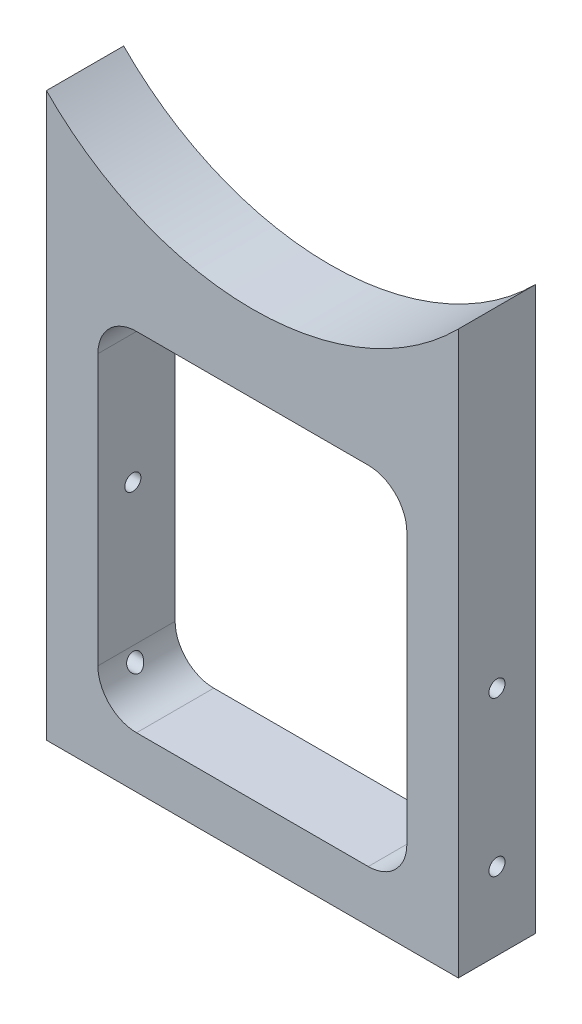
ISO-10303-21;
HEADER;
FILE_DESCRIPTION(('STEP AP214'),'2;1');
FILE_NAME('part.step','',(''),(''),'','','');
FILE_SCHEMA(('AUTOMOTIVE_DESIGN { 1 0 10303 214 1 1 1 1 }'));
ENDSEC;
DATA;
#1=APPLICATION_CONTEXT('core data for automotive mechanical design processes');
#2=APPLICATION_PROTOCOL_DEFINITION('international standard','automotive_design',2000,#1);
#3=PRODUCT_CONTEXT('',#1,'mechanical');
#4=PRODUCT('Part','Part','',(#3));
#5=PRODUCT_RELATED_PRODUCT_CATEGORY('part','',(#4));
#6=PRODUCT_DEFINITION_FORMATION('','',#4);
#7=PRODUCT_DEFINITION_CONTEXT('part definition',#1,'design');
#8=PRODUCT_DEFINITION('design','',#6,#7);
#9=PRODUCT_DEFINITION_SHAPE('','',#8);
#10=(LENGTH_UNIT() NAMED_UNIT(*) SI_UNIT(.MILLI.,.METRE.));
#11=(NAMED_UNIT(*) PLANE_ANGLE_UNIT() SI_UNIT($,.RADIAN.));
#12=(NAMED_UNIT(*) SI_UNIT($,.STERADIAN.) SOLID_ANGLE_UNIT());
#13=UNCERTAINTY_MEASURE_WITH_UNIT(LENGTH_MEASURE(1.E-05),#10,'distance_accuracy_value','');
#14=(GEOMETRIC_REPRESENTATION_CONTEXT(3) GLOBAL_UNCERTAINTY_ASSIGNED_CONTEXT((#13)) GLOBAL_UNIT_ASSIGNED_CONTEXT((#10,
#11,#12)) REPRESENTATION_CONTEXT('',''));
#15=CARTESIAN_POINT('',(0.,0.,0.));
#16=DIRECTION('',(0.,0.,1.));
#17=DIRECTION('',(1.,0.,0.));
#18=AXIS2_PLACEMENT_3D('',#15,#16,#17);
#19=CARTESIAN_POINT('',(-9.00000000000001,9.5,6.));
#20=DIRECTION('',(0.,0.,-1.));
#21=DIRECTION('',(-1.,0.,0.));
#22=AXIS2_PLACEMENT_3D('',#19,#20,#21);
#23=CYLINDRICAL_SURFACE('',#22,3.);
#24=CARTESIAN_POINT('',(-9.00000000000001,9.5,0.));
#25=DIRECTION('',(0.,0.,1.));
#26=DIRECTION('',(1.,0.,0.));
#27=AXIS2_PLACEMENT_3D('',#24,#25,#26);
#28=CIRCLE('',#27,3.);
#29=CARTESIAN_POINT('',(-8.99999999999998,12.5,0.));
#30=VERTEX_POINT('',#29);
#31=CARTESIAN_POINT('',(-12.,9.49999999999998,0.));
#32=VERTEX_POINT('',#31);
#33=EDGE_CURVE('E178',#30,#32,#28,.T.);
#34=ORIENTED_EDGE('',*,*,#33,.F.);
#35=DIRECTION('',(0.,0.,-1.));
#36=VECTOR('',#35,1.);
#37=CARTESIAN_POINT('',(-8.99999999999998,12.5,6.));
#38=LINE('',#37,#36);
#39=CARTESIAN_POINT('',(-8.99999999999998,12.5,6.));
#40=VERTEX_POINT('',#39);
#41=EDGE_CURVE('E11',#40,#30,#38,.T.);
#42=ORIENTED_EDGE('',*,*,#41,.F.);
#43=CARTESIAN_POINT('',(-9.00000000000001,9.5,6.));
#44=DIRECTION('',(0.,0.,1.));
#45=DIRECTION('',(1.,0.,0.));
#46=AXIS2_PLACEMENT_3D('',#43,#44,#45);
#47=CIRCLE('',#46,3.);
#48=CARTESIAN_POINT('',(-12.,9.49999999999998,6.));
#49=VERTEX_POINT('',#48);
#50=EDGE_CURVE('E235',#40,#49,#47,.T.);
#51=ORIENTED_EDGE('',*,*,#50,.T.);
#52=DIRECTION('',(0.,0.,-1.));
#53=VECTOR('',#52,1.);
#54=CARTESIAN_POINT('',(-12.,9.49999999999998,6.));
#55=LINE('',#54,#53);
#56=EDGE_CURVE('E104',#49,#32,#55,.T.);
#57=ORIENTED_EDGE('',*,*,#56,.T.);
#58=EDGE_LOOP('',(#34,#42,#51,#57));
#59=FACE_BOUND('',#58,.T.);
#60=ADVANCED_FACE('F39',(#59),#23,.F.);
#61=CARTESIAN_POINT('',(0.,12.5,6.));
#62=DIRECTION('',(0.,1.,0.));
#63=DIRECTION('',(0.,0.,1.));
#64=AXIS2_PLACEMENT_3D('',#61,#62,#63);
#65=PLANE('',#64);
#66=DIRECTION('',(1.,0.,0.));
#67=VECTOR('',#66,1.);
#68=CARTESIAN_POINT('',(0.,12.5,0.));
#69=LINE('',#68,#67);
#70=CARTESIAN_POINT('',(8.99999999999998,12.5,0.));
#71=VERTEX_POINT('',#70);
#72=EDGE_CURVE('E181',#30,#71,#69,.T.);
#73=ORIENTED_EDGE('',*,*,#72,.T.);
#74=DIRECTION('',(0.,0.,-1.));
#75=VECTOR('',#74,1.);
#76=CARTESIAN_POINT('',(8.99999999999998,12.5,6.));
#77=LINE('',#76,#75);
#78=CARTESIAN_POINT('',(8.99999999999998,12.5,6.));
#79=VERTEX_POINT('',#78);
#80=EDGE_CURVE('E49',#79,#71,#77,.T.);
#81=ORIENTED_EDGE('',*,*,#80,.F.);
#82=DIRECTION('',(1.,0.,0.));
#83=VECTOR('',#82,1.);
#84=CARTESIAN_POINT('',(0.,12.5,6.));
#85=LINE('',#84,#83);
#86=EDGE_CURVE('E241',#40,#79,#85,.T.);
#87=ORIENTED_EDGE('',*,*,#86,.F.);
#88=ORIENTED_EDGE('',*,*,#41,.T.);
#89=EDGE_LOOP('',(#73,#81,#87,#88));
#90=FACE_BOUND('',#89,.T.);
#91=ADVANCED_FACE('F273',(#90),#65,.F.);
#92=CARTESIAN_POINT('',(9.,9.5,6.));
#93=DIRECTION('',(0.,0.,-1.));
#94=DIRECTION('',(-1.,0.,0.));
#95=AXIS2_PLACEMENT_3D('',#92,#93,#94);
#96=CYLINDRICAL_SURFACE('',#95,3.);
#97=CARTESIAN_POINT('',(9.,9.5,0.));
#98=DIRECTION('',(0.,0.,1.));
#99=DIRECTION('',(1.,0.,0.));
#100=AXIS2_PLACEMENT_3D('',#97,#98,#99);
#101=CIRCLE('',#100,3.);
#102=CARTESIAN_POINT('',(12.,9.49999999999998,0.));
#103=VERTEX_POINT('',#102);
#104=EDGE_CURVE('E184',#71,#103,#101,.F.);
#105=ORIENTED_EDGE('',*,*,#104,.T.);
#106=DIRECTION('',(0.,0.,-1.));
#107=VECTOR('',#106,1.);
#108=CARTESIAN_POINT('',(12.,9.49999999999998,6.));
#109=LINE('',#108,#107);
#110=CARTESIAN_POINT('',(12.,9.49999999999998,6.));
#111=VERTEX_POINT('',#110);
#112=EDGE_CURVE('E204',#111,#103,#109,.T.);
#113=ORIENTED_EDGE('',*,*,#112,.F.);
#114=CARTESIAN_POINT('',(9.,9.5,6.));
#115=DIRECTION('',(0.,0.,1.));
#116=DIRECTION('',(1.,0.,0.));
#117=AXIS2_PLACEMENT_3D('',#114,#115,#116);
#118=CIRCLE('',#117,3.);
#119=EDGE_CURVE('E244',#79,#111,#118,.F.);
#120=ORIENTED_EDGE('',*,*,#119,.F.);
#121=ORIENTED_EDGE('',*,*,#80,.T.);
#122=EDGE_LOOP('',(#105,#113,#120,#121));
#123=FACE_BOUND('',#122,.T.);
#124=ADVANCED_FACE('F255',(#123),#96,.F.);
#125=CARTESIAN_POINT('',(12.,0.,6.));
#126=DIRECTION('',(-1.,0.,0.));
#127=DIRECTION('',(0.,-1.,0.));
#128=AXIS2_PLACEMENT_3D('',#125,#126,#127);
#129=PLANE('',#128);
#130=CARTESIAN_POINT('',(12.,-0.5,3.));
#131=DIRECTION('',(-1.,0.,0.));
#132=DIRECTION('',(0.,-1.,0.));
#133=AXIS2_PLACEMENT_3D('',#130,#131,#132);
#134=CIRCLE('',#133,0.625);
#135=CARTESIAN_POINT('',(12.,-1.125,3.));
#136=VERTEX_POINT('',#135);
#137=EDGE_CURVE('E169',#136,#136,#134,.T.);
#138=ORIENTED_EDGE('',*,*,#137,.F.);
#139=EDGE_LOOP('',(#138));
#140=FACE_BOUND('',#139,.T.);
#141=DIRECTION('',(0.,1.,0.));
#142=VECTOR('',#141,1.);
#143=CARTESIAN_POINT('',(12.,0.,0.));
#144=LINE('',#143,#142);
#145=CARTESIAN_POINT('',(12.,-11.5,0.));
#146=VERTEX_POINT('',#145);
#147=EDGE_CURVE('E187',#146,#103,#144,.T.);
#148=ORIENTED_EDGE('',*,*,#147,.F.);
#149=DIRECTION('',(0.,0.,-1.));
#150=VECTOR('',#149,1.);
#151=CARTESIAN_POINT('',(12.,-11.5,6.));
#152=LINE('',#151,#150);
#153=CARTESIAN_POINT('',(12.,-11.5,6.));
#154=VERTEX_POINT('',#153);
#155=EDGE_CURVE('E202',#154,#146,#152,.T.);
#156=ORIENTED_EDGE('',*,*,#155,.F.);
#157=DIRECTION('',(0.,1.,0.));
#158=VECTOR('',#157,1.);
#159=CARTESIAN_POINT('',(12.,0.,6.));
#160=LINE('',#159,#158);
#161=EDGE_CURVE('E246',#154,#111,#160,.T.);
#162=ORIENTED_EDGE('',*,*,#161,.T.);
#163=ORIENTED_EDGE('',*,*,#112,.T.);
#164=EDGE_LOOP('',(#148,#156,#162,#163));
#165=FACE_BOUND('',#164,.T.);
#166=ADVANCED_FACE('F250',(#140,#165),#129,.T.);
#167=CARTESIAN_POINT('',(9.,-11.5,6.));
#168=DIRECTION('',(0.,0.,-1.));
#169=DIRECTION('',(-1.,0.,0.));
#170=AXIS2_PLACEMENT_3D('',#167,#168,#169);
#171=CYLINDRICAL_SURFACE('',#170,3.);
#172=CARTESIAN_POINT('',(11.9764702249477,-11.875,3.));
#173=CARTESIAN_POINT('',(11.9764703090511,-11.8750003356118,3.03482382226987));
#174=CARTESIAN_POINT('',(11.9761069646786,-11.877918143304,3.06965128197802));
#175=CARTESIAN_POINT('',(11.974612501748,-11.8895047090639,3.13832365698512));
#176=CARTESIAN_POINT('',(11.9734812511529,-11.8981744561397,3.17216840226802));
#177=CARTESIAN_POINT('',(11.9703343283495,-11.9210058395248,3.23791064601869));
#178=CARTESIAN_POINT('',(11.9683186254897,-11.9351676661668,3.26980807695628));
#179=CARTESIAN_POINT('',(11.9632324186143,-11.9685481148077,3.33074242977188));
#180=CARTESIAN_POINT('',(11.9601619897179,-11.9877663766569,3.35977955517572));
#181=CARTESIAN_POINT('',(11.9527813176848,-12.0306154037981,3.41412332984023));
#182=CARTESIAN_POINT('',(11.948473380135,-12.0542379350877,3.43943678522055));
#183=CARTESIAN_POINT('',(11.9384439825653,-12.1051601702134,3.48570561173041));
#184=CARTESIAN_POINT('',(11.9327225852513,-12.1324597109002,3.50666117611536));
#185=CARTESIAN_POINT('',(11.9197416476608,-12.1899102828414,3.54372807498777));
#186=CARTESIAN_POINT('',(11.9124792894811,-12.2200664812704,3.55983040214307));
#187=CARTESIAN_POINT('',(11.8964004962904,-12.2822369617458,3.58681607228027));
#188=CARTESIAN_POINT('',(11.8875839400068,-12.3142513886571,3.5976990077515));
#189=CARTESIAN_POINT('',(11.8682526175938,-12.3799581982609,3.61432114663219));
#190=CARTESIAN_POINT('',(11.8577026616999,-12.4136723528713,3.61993279738662));
#191=CARTESIAN_POINT('',(11.8352563454918,-12.4811146386056,3.62563142152863));
#192=CARTESIAN_POINT('',(11.8233596461453,-12.5148427711096,3.6257170006583));
#193=CARTESIAN_POINT('',(11.7977975602801,-12.5833935624684,3.62041833341663));
#194=CARTESIAN_POINT('',(11.784069956605,-12.6181686621229,3.61472130395371));
#195=CARTESIAN_POINT('',(11.7558603723934,-12.6859953839881,3.59770775952619));
#196=CARTESIAN_POINT('',(11.7413781239435,-12.7190463856626,3.58638923648893));
#197=CARTESIAN_POINT('',(11.7111471244074,-12.7849452757464,3.55750684987418));
#198=CARTESIAN_POINT('',(11.695380370586,-12.8176189774986,3.53956319218695));
#199=CARTESIAN_POINT('',(11.6642745805296,-12.8794347499195,3.49803793650123));
#200=CARTESIAN_POINT('',(11.6489358370762,-12.9085744466333,3.47445257997987));
#201=CARTESIAN_POINT('',(11.6192676675109,-12.9630160837033,3.4215554918017));
#202=CARTESIAN_POINT('',(11.6049628268777,-12.9882349875253,3.39214386463641));
#203=CARTESIAN_POINT('',(11.5787774163117,-13.0331615582233,3.32844555559407));
#204=CARTESIAN_POINT('',(11.5668929668782,-13.0528780636551,3.29416682701525));
#205=CARTESIAN_POINT('',(11.5491365522744,-13.0818088951998,3.23030937556022));
#206=CARTESIAN_POINT('',(11.5425064628171,-13.0924069902816,3.2015651115043));
#207=CARTESIAN_POINT('',(11.5318233805545,-13.109338883508,3.14239252898424));
#208=CARTESIAN_POINT('',(11.527768206008,-13.1156762920268,3.11196566003208));
#209=CARTESIAN_POINT('',(11.5225795388462,-13.1237662006149,3.05015255755757));
#210=CARTESIAN_POINT('',(11.5214557646674,-13.1255034501189,3.01876348106536));
#211=CARTESIAN_POINT('',(11.5222671131103,-13.1242441604155,2.95611859809129));
#212=CARTESIAN_POINT('',(11.5242023828447,-13.1212473935443,2.92486279809132));
#213=CARTESIAN_POINT('',(11.5307668141299,-13.1109788819801,2.86508726225721));
#214=CARTESIAN_POINT('',(11.5352485713544,-13.1039408488149,2.83651015410968));
#215=CARTESIAN_POINT('',(11.5464423504161,-13.0861088962035,2.78102206334978));
#216=CARTESIAN_POINT('',(11.5531548686801,-13.0753141407223,2.75411145317761));
#217=CARTESIAN_POINT('',(11.5689120267604,-13.0494949154549,2.70062832881701));
#218=CARTESIAN_POINT('',(11.5780876415788,-13.0342260532607,2.67421317433335));
#219=CARTESIAN_POINT('',(11.5979477498059,-13.0003509563189,2.62425249837677));
#220=CARTESIAN_POINT('',(11.6086329774338,-12.9817430964111,2.60070838371353));
#221=CARTESIAN_POINT('',(11.6326156042512,-12.9387575110524,2.55359849460178));
#222=CARTESIAN_POINT('',(11.6460676416854,-12.9139348259913,2.53051701936545));
#223=CARTESIAN_POINT('',(11.6736173024196,-12.8611241097611,2.48877729209727));
#224=CARTESIAN_POINT('',(11.6877153030313,-12.8331342142063,2.47012166556775));
#225=CARTESIAN_POINT('',(11.7175742047442,-12.7712578694488,2.43570092792535));
#226=CARTESIAN_POINT('',(11.7333440430715,-12.7370622292115,2.42049575219016));
#227=CARTESIAN_POINT('',(11.7642946215852,-12.6662623666049,2.39636043974739));
#228=CARTESIAN_POINT('',(11.7794752610239,-12.6296577351794,2.38743137176991));
#229=CARTESIAN_POINT('',(11.8088417182555,-12.5545385736942,2.37621435390957));
#230=CARTESIAN_POINT('',(11.8230139196794,-12.5160067877993,2.37400481393952));
#231=CARTESIAN_POINT('',(11.8496769926953,-12.4386230530258,2.37681883712478));
#232=CARTESIAN_POINT('',(11.862168610686,-12.3997712544652,2.38183917759542));
#233=CARTESIAN_POINT('',(11.8844033135709,-12.3256033144596,2.39869896992142));
#234=CARTESIAN_POINT('',(11.8942714729548,-12.2902204502091,2.41007925988178));
#235=CARTESIAN_POINT('',(11.9121257848968,-12.2216495460354,2.43916920269116));
#236=CARTESIAN_POINT('',(11.9201126964338,-12.1884606248791,2.45687629574467));
#237=CARTESIAN_POINT('',(11.9337813968351,-12.1275666612881,2.49685076752733));
#238=CARTESIAN_POINT('',(11.9395784290266,-12.0996461812289,2.51875146527051));
#239=CARTESIAN_POINT('',(11.9496840713564,-12.0477801575039,2.56712701529801));
#240=CARTESIAN_POINT('',(11.9539928663597,-12.0238341203346,2.59360129884943));
#241=CARTESIAN_POINT('',(11.9612148674723,-11.9813114980026,2.64958588334438));
#242=CARTESIAN_POINT('',(11.9641624764304,-11.9626078744344,2.67899543732252));
#243=CARTESIAN_POINT('',(11.9690217915971,-11.9303223824811,2.74057663078007));
#244=CARTESIAN_POINT('',(11.9709337003357,-11.9167395128961,2.77274772881603));
#245=CARTESIAN_POINT('',(11.9738060610007,-11.8957071029608,2.8370976758456));
#246=CARTESIAN_POINT('',(11.9748133144291,-11.8879597223175,2.86917755630227));
#247=CARTESIAN_POINT('',(11.9761453604752,-11.8776059834388,2.93417053499787));
#248=CARTESIAN_POINT('',(11.976470145451,-11.8749996827713,2.96708364256278));
#249=CARTESIAN_POINT('',(11.9764702249477,-11.875,3.));
#250=B_SPLINE_CURVE_WITH_KNOTS('',3,(#172,#173,#174,#175,#176,#177,#178,#179,#180,#181,#182,
#183,#184,#185,#186,#187,#188,#189,#190,#191,#192,#193,#194,#195,#196,#197,#198,#199,#200,#201,
#202,#203,#204,#205,#206,#207,#208,#209,#210,#211,#212,#213,#214,#215,#216,#217,#218,#219,#220,
#221,#222,#223,#224,#225,#226,#227,#228,#229,#230,#231,#232,#233,#234,#235,#236,#237,#238,#239,
#240,#241,#242,#243,#244,#245,#246,#247,#248,#249),.UNSPECIFIED.,.T.,.F.,(4,2,2,2,2,2,2,2,2,2,2,
2,2,2,2,2,2,2,2,2,2,2,2,2,2,2,2,2,2,2,2,2,2,2,2,2,2,2,4),(0.,0.104354650583023,
0.208727248914331,0.31310346468957,0.417472248173352,0.521647830769545,0.625818792600818,
0.730181915878858,0.834553186115117,0.941389448713036,1.04825266657554,1.16122122666544,
1.27423016969034,1.39510325608939,1.51605709401289,1.63929925984822,1.76234230595295,
1.85598096068991,1.94954016857685,2.0434091602648,2.13728266634628,2.22620704896979,
2.31515123382263,2.41036106341917,2.50561735995585,2.61457938923046,2.72360589623751,
2.84487698813629,2.96616872574293,3.08887048396358,3.21151756538756,3.32627948303905,
3.44099502102518,3.54833024284059,3.65565212694041,3.76008895241692,3.86450534800526,
3.96314289816437,4.06178155282461),.UNSPECIFIED.);
#251=CARTESIAN_POINT('',(11.9764702249477,-11.875,3.));
#252=VERTEX_POINT('',#251);
#253=EDGE_CURVE('E339',#252,#252,#250,.T.);
#254=ORIENTED_EDGE('',*,*,#253,.T.);
#255=EDGE_LOOP('',(#254));
#256=FACE_BOUND('',#255,.T.);
#257=CARTESIAN_POINT('',(9.,-11.5,0.));
#258=DIRECTION('',(0.,0.,1.));
#259=DIRECTION('',(1.,0.,0.));
#260=AXIS2_PLACEMENT_3D('',#257,#258,#259);
#261=CIRCLE('',#260,3.);
#262=CARTESIAN_POINT('',(8.99999999999998,-14.5,0.));
#263=VERTEX_POINT('',#262);
#264=EDGE_CURVE('E190',#146,#263,#261,.F.);
#265=ORIENTED_EDGE('',*,*,#264,.T.);
#266=DIRECTION('',(0.,0.,-1.));
#267=VECTOR('',#266,1.);
#268=CARTESIAN_POINT('',(8.99999999999998,-14.5,6.));
#269=LINE('',#268,#267);
#270=CARTESIAN_POINT('',(8.99999999999998,-14.5,6.));
#271=VERTEX_POINT('',#270);
#272=EDGE_CURVE('E150',#271,#263,#269,.T.);
#273=ORIENTED_EDGE('',*,*,#272,.F.);
#274=CARTESIAN_POINT('',(9.,-11.5,6.));
#275=DIRECTION('',(0.,0.,1.));
#276=DIRECTION('',(1.,0.,0.));
#277=AXIS2_PLACEMENT_3D('',#274,#275,#276);
#278=CIRCLE('',#277,3.);
#279=EDGE_CURVE('E156',#154,#271,#278,.F.);
#280=ORIENTED_EDGE('',*,*,#279,.F.);
#281=ORIENTED_EDGE('',*,*,#155,.T.);
#282=EDGE_LOOP('',(#265,#273,#280,#281));
#283=FACE_BOUND('',#282,.T.);
#284=ADVANCED_FACE('F259',(#256,#283),#171,.F.);
#285=CARTESIAN_POINT('',(0.,-14.5,6.));
#286=DIRECTION('',(0.,1.,0.));
#287=DIRECTION('',(0.,0.,1.));
#288=AXIS2_PLACEMENT_3D('',#285,#286,#287);
#289=PLANE('',#288);
#290=DIRECTION('',(1.,0.,0.));
#291=VECTOR('',#290,1.);
#292=CARTESIAN_POINT('',(0.,-14.5,0.));
#293=LINE('',#292,#291);
#294=CARTESIAN_POINT('',(-8.99999999999998,-14.5,0.));
#295=VERTEX_POINT('',#294);
#296=EDGE_CURVE('E145',#295,#263,#293,.T.);
#297=ORIENTED_EDGE('',*,*,#296,.F.);
#298=DIRECTION('',(0.,0.,-1.));
#299=VECTOR('',#298,1.);
#300=CARTESIAN_POINT('',(-8.99999999999998,-14.5,6.));
#301=LINE('',#300,#299);
#302=CARTESIAN_POINT('',(-8.99999999999998,-14.5,6.));
#303=VERTEX_POINT('',#302);
#304=EDGE_CURVE('E140',#303,#295,#301,.T.);
#305=ORIENTED_EDGE('',*,*,#304,.F.);
#306=DIRECTION('',(1.,0.,0.));
#307=VECTOR('',#306,1.);
#308=CARTESIAN_POINT('',(0.,-14.5,6.));
#309=LINE('',#308,#307);
#310=EDGE_CURVE('E143',#303,#271,#309,.T.);
#311=ORIENTED_EDGE('',*,*,#310,.T.);
#312=ORIENTED_EDGE('',*,*,#272,.T.);
#313=EDGE_LOOP('',(#297,#305,#311,#312));
#314=FACE_BOUND('',#313,.T.);
#315=ADVANCED_FACE('F142',(#314),#289,.T.);
#316=CARTESIAN_POINT('',(-9.,-11.5,6.));
#317=DIRECTION('',(0.,0.,-1.));
#318=DIRECTION('',(-1.,0.,0.));
#319=AXIS2_PLACEMENT_3D('',#316,#317,#318);
#320=CYLINDRICAL_SURFACE('',#319,3.);
#321=CARTESIAN_POINT('',(-11.8284271247462,-12.5,3.90977548780326));
#322=CARTESIAN_POINT('',(-11.8150124089229,-12.5379398472598,3.90977444655704));
#323=CARTESIAN_POINT('',(-11.8008233549699,-12.5756205844147,3.90631255338893));
#324=CARTESIAN_POINT('',(-11.7713770583407,-12.6493698791965,3.89282343235476));
#325=CARTESIAN_POINT('',(-11.7561187851211,-12.6854368250002,3.88278979051909));
#326=CARTESIAN_POINT('',(-11.725161602672,-12.7549658706356,3.85660966766704));
#327=CARTESIAN_POINT('',(-11.7094637298049,-12.788433493368,3.84047659992287));
#328=CARTESIAN_POINT('',(-11.6782713670648,-12.8520798144015,3.80250006151009));
#329=CARTESIAN_POINT('',(-11.6627769423295,-12.8822574809085,3.7806548066471));
#330=CARTESIAN_POINT('',(-11.6323971108842,-12.9392904029245,3.73100023505401));
#331=CARTESIAN_POINT('',(-11.6175386637874,-12.9660366299111,3.70304841436614));
#332=CARTESIAN_POINT('',(-11.5899252344519,-13.0142854578126,3.64204663804565));
#333=CARTESIAN_POINT('',(-11.5771675246426,-13.0357948757897,3.60900340275176));
#334=CARTESIAN_POINT('',(-11.5574495786823,-13.0683523186817,3.54658463469864));
#335=CARTESIAN_POINT('',(-11.5498307115423,-13.0806664735583,3.51807523660657));
#336=CARTESIAN_POINT('',(-11.5370990533401,-13.1010226322127,3.45904274077041));
#337=CARTESIAN_POINT('',(-11.5319841178287,-13.1090682921662,3.42852139163973));
#338=CARTESIAN_POINT('',(-11.5246856931419,-13.1204967614912,3.36612910163082));
#339=CARTESIAN_POINT('',(-11.5225147363225,-13.1238596381303,3.33425298312588));
#340=CARTESIAN_POINT('',(-11.5213613939655,-13.125650106771,3.27030367132598));
#341=CARTESIAN_POINT('',(-11.5223786156088,-13.1240783067797,3.23823050279575));
#342=CARTESIAN_POINT('',(-11.5273129384284,-13.1163870264236,3.17720793274542));
#343=CARTESIAN_POINT('',(-11.5310191522684,-13.1105981480643,3.14819836267385));
#344=CARTESIAN_POINT('',(-11.5407905128396,-13.0951383853412,3.09165667390315));
#345=CARTESIAN_POINT('',(-11.5468560968948,-13.0854667812793,3.06412483018708));
#346=CARTESIAN_POINT('',(-11.5612850724044,-13.062055124972,3.00974918167677));
#347=CARTESIAN_POINT('',(-11.5697492713129,-13.0481338463928,2.98301082442993));
#348=CARTESIAN_POINT('',(-11.5882964014913,-13.0169215914557,2.9322031468155));
#349=CARTESIAN_POINT('',(-11.5983800541937,-12.9996291125614,2.90813502409831));
#350=CARTESIAN_POINT('',(-11.6211537744895,-12.9595050984903,2.85980616539485));
#351=CARTESIAN_POINT('',(-11.6340112251048,-12.9362374453846,2.8359863445484));
#352=CARTESIAN_POINT('',(-11.6605300519434,-12.886497516833,2.79249758592286));
#353=CARTESIAN_POINT('',(-11.6741919085139,-12.8600233164324,2.77283116113981));
#354=CARTESIAN_POINT('',(-11.7034610367323,-12.8009657704798,2.73577227274815));
#355=CARTESIAN_POINT('',(-11.7191001844444,-12.7680317392269,2.71896064371658));
#356=CARTESIAN_POINT('',(-11.7499952593537,-12.6995571703877,2.69134031059232));
#357=CARTESIAN_POINT('',(-11.765251080644,-12.6640159228729,2.68053324842502));
#358=CARTESIAN_POINT('',(-11.7952088462745,-12.5901549897254,2.66513121731209));
#359=CARTESIAN_POINT('',(-11.8098831172494,-12.5517852587772,2.66071964717653));
#360=CARTESIAN_POINT('',(-11.8376700387615,-12.4743300764685,2.65910416181911));
#361=CARTESIAN_POINT('',(-11.8507832903115,-12.4352449072919,2.66189746317787));
#362=CARTESIAN_POINT('',(-11.8743660972348,-12.3599346682431,2.67454618696307));
#363=CARTESIAN_POINT('',(-11.8849442252337,-12.3236742470978,2.68398684910967));
#364=CARTESIAN_POINT('',(-11.904193227412,-12.2529955204582,2.7094299861694));
#365=CARTESIAN_POINT('',(-11.9128649356625,-12.2185764143839,2.72542958269376));
#366=CARTESIAN_POINT('',(-11.9277587640368,-12.1551483173406,2.76232386092127));
#367=CARTESIAN_POINT('',(-11.9341078493796,-12.1259303149646,2.78280895063924));
#368=CARTESIAN_POINT('',(-11.9452435371163,-12.0712443905536,2.82863370810013));
#369=CARTESIAN_POINT('',(-11.9500304332776,-12.045775763949,2.85397246169489));
#370=CARTESIAN_POINT('',(-11.9580889054168,-12.0002291773139,2.90786893683274));
#371=CARTESIAN_POINT('',(-11.9614049129787,-11.9800021783309,2.93629430691634));
#372=CARTESIAN_POINT('',(-11.966938501963,-11.9445216753647,2.99619226162851));
#373=CARTESIAN_POINT('',(-11.9691561261002,-11.9292679779843,3.02766472770267));
#374=CARTESIAN_POINT('',(-11.9726637228966,-11.9042647905324,3.09260435207056));
#375=CARTESIAN_POINT('',(-11.9739579313089,-11.8944902123476,3.12606162983394));
#376=CARTESIAN_POINT('',(-11.9757639015606,-11.8806292062351,3.19415510972096));
#377=CARTESIAN_POINT('',(-11.9762756524514,-11.8765428579001,3.22879132833404));
#378=CARTESIAN_POINT('',(-11.9765740817113,-11.8741768255636,3.29834859025294));
#379=CARTESIAN_POINT('',(-11.9763590063658,-11.8759111859237,3.3332701193524));
#380=CARTESIAN_POINT('',(-11.9751753548996,-11.8851661742589,3.40232510501929));
#381=CARTESIAN_POINT('',(-11.9742067749153,-11.8926868319031,3.43645855754493));
#382=CARTESIAN_POINT('',(-11.9714130327657,-11.9132940002596,3.50298189751701));
#383=CARTESIAN_POINT('',(-11.9695874960791,-11.9263829442817,3.53537101571973));
#384=CARTESIAN_POINT('',(-11.9649175441958,-11.9577267372728,3.59746390001947));
#385=CARTESIAN_POINT('',(-11.9620731745257,-11.9759813554057,3.62716778603189));
#386=CARTESIAN_POINT('',(-11.955182564968,-12.0170365309583,3.68298229130029));
#387=CARTESIAN_POINT('',(-11.9511391251731,-12.0398264570956,3.70910107694502));
#388=CARTESIAN_POINT('',(-11.9416687068791,-12.0892509785243,3.75710696067192));
#389=CARTESIAN_POINT('',(-11.936241705647,-12.1158856369846,3.77899398921242));
#390=CARTESIAN_POINT('',(-11.9238715890809,-12.1721641180865,3.81799401616028));
#391=CARTESIAN_POINT('',(-11.9169270991478,-12.2018106558899,3.83510265389901));
#392=CARTESIAN_POINT('',(-11.9014837444087,-12.2631450628607,3.86415076810486));
#393=CARTESIAN_POINT('',(-11.8929853637061,-12.2948322942785,3.87609185059647));
#394=CARTESIAN_POINT('',(-11.8756034862146,-12.3554399191755,3.89354507491671));
#395=CARTESIAN_POINT('',(-11.8668871982546,-12.3842387893668,3.89965469957274));
#396=CARTESIAN_POINT('',(-11.8484060935983,-12.4420751454656,3.90777072483221));
#397=CARTESIAN_POINT('',(-11.8386410614515,-12.4711126792675,3.90977628060597));
#398=CARTESIAN_POINT('',(-11.8284271247462,-12.5,3.90977548780326));
#399=B_SPLINE_CURVE_WITH_KNOTS('',3,(#321,#322,#323,#324,#325,#326,#327,#328,#329,#330,#331,
#332,#333,#334,#335,#336,#337,#338,#339,#340,#341,#342,#343,#344,#345,#346,#347,#348,#349,#350,
#351,#352,#353,#354,#355,#356,#357,#358,#359,#360,#361,#362,#363,#364,#365,#366,#367,#368,#369,
#370,#371,#372,#373,#374,#375,#376,#377,#378,#379,#380,#381,#382,#383,#384,#385,#386,#387,#388,
#389,#390,#391,#392,#393,#394,#395,#396,#397,#398),.UNSPECIFIED.,.T.,.F.,(4,2,2,2,2,2,2,2,2,2,2,
2,2,2,2,2,2,2,2,2,2,2,2,2,2,2,2,2,2,2,2,2,2,2,2,2,2,2,4),(0.,0.120607668607413,
0.241333225010231,0.361794823206196,0.482294092467814,0.605981507590218,0.72950704015914,
0.825035717207288,0.920482436601347,1.01633420523955,1.11217416433587,1.20121363959451,
1.29026962674678,1.38383546882843,1.4774431087257,1.58410058720471,1.69082241465533,
1.81072503343166,1.93066042299585,2.0539713717498,2.17723468958154,2.293419499502,
2.40955337620154,2.51774512065107,2.62591650806449,2.73055076361213,2.83518094975329,
2.93932805156682,3.04347661064892,3.14787664264817,3.25227720995974,3.35672344666971,
3.46116501677899,3.56536458807361,3.66956587156392,3.77386193875151,3.87812556844455,
3.96993709861733,4.06176752645225),.UNSPECIFIED.);
#400=CARTESIAN_POINT('',(-11.8284271247462,-12.5,3.90977548780326));
#401=VERTEX_POINT('',#400);
#402=EDGE_CURVE('E308',#401,#401,#399,.T.);
#403=ORIENTED_EDGE('',*,*,#402,.F.);
#404=EDGE_LOOP('',(#403));
#405=FACE_BOUND('',#404,.T.);
#406=CARTESIAN_POINT('',(-9.,-11.5,0.));
#407=DIRECTION('',(0.,0.,1.));
#408=DIRECTION('',(1.,0.,0.));
#409=AXIS2_PLACEMENT_3D('',#406,#407,#408);
#410=CIRCLE('',#409,3.);
#411=CARTESIAN_POINT('',(-12.,-11.5,0.));
#412=VERTEX_POINT('',#411);
#413=EDGE_CURVE('E194',#412,#295,#410,.T.);
#414=ORIENTED_EDGE('',*,*,#413,.F.);
#415=DIRECTION('',(0.,0.,-1.));
#416=VECTOR('',#415,1.);
#417=CARTESIAN_POINT('',(-12.,-11.5,6.));
#418=LINE('',#417,#416);
#419=CARTESIAN_POINT('',(-12.,-11.5,6.));
#420=VERTEX_POINT('',#419);
#421=EDGE_CURVE('E97',#420,#412,#418,.T.);
#422=ORIENTED_EDGE('',*,*,#421,.F.);
#423=CARTESIAN_POINT('',(-9.,-11.5,6.));
#424=DIRECTION('',(0.,0.,1.));
#425=DIRECTION('',(1.,0.,0.));
#426=AXIS2_PLACEMENT_3D('',#423,#424,#425);
#427=CIRCLE('',#426,3.);
#428=EDGE_CURVE('E153',#420,#303,#427,.T.);
#429=ORIENTED_EDGE('',*,*,#428,.T.);
#430=ORIENTED_EDGE('',*,*,#304,.T.);
#431=EDGE_LOOP('',(#414,#422,#429,#430));
#432=FACE_BOUND('',#431,.T.);
#433=ADVANCED_FACE('F159',(#405,#432),#320,.F.);
#434=CARTESIAN_POINT('',(-16.,0.,6.));
#435=DIRECTION('',(-1.,0.,0.));
#436=DIRECTION('',(0.,0.,1.));
#437=AXIS2_PLACEMENT_3D('',#434,#435,#436);
#438=PLANE('',#437);
#439=CARTESIAN_POINT('',(-16.,-12.5,3.28477548780326));
#440=DIRECTION('',(-1.,0.,0.));
#441=DIRECTION('',(0.,0.,1.));
#442=AXIS2_PLACEMENT_3D('',#439,#440,#441);
#443=CIRCLE('',#442,0.625);
#444=CARTESIAN_POINT('',(-16.,-12.5,3.90977548780326));
#445=VERTEX_POINT('',#444);
#446=EDGE_CURVE('E300',#445,#445,#443,.T.);
#447=ORIENTED_EDGE('',*,*,#446,.F.);
#448=EDGE_LOOP('',(#447));
#449=FACE_BOUND('',#448,.T.);
#450=CARTESIAN_POINT('',(-16.,-0.499999999999999,3.28477548780322));
#451=DIRECTION('',(-1.,0.,0.));
#452=DIRECTION('',(0.,0.,1.));
#453=AXIS2_PLACEMENT_3D('',#450,#451,#452);
#454=CIRCLE('',#453,0.625);
#455=CARTESIAN_POINT('',(-16.,-0.499999999999999,3.90977548780322));
#456=VERTEX_POINT('',#455);
#457=EDGE_CURVE('E303',#456,#456,#454,.T.);
#458=ORIENTED_EDGE('',*,*,#457,.F.);
#459=EDGE_LOOP('',(#458));
#460=FACE_BOUND('',#459,.T.);
#461=DIRECTION('',(0.,1.,0.));
#462=VECTOR('',#461,1.);
#463=CARTESIAN_POINT('',(-16.,0.,0.));
#464=LINE('',#463,#462);
#465=CARTESIAN_POINT('',(-16.,-18.5,0.));
#466=VERTEX_POINT('',#465);
#467=CARTESIAN_POINT('',(-16.,25.2,0.));
#468=VERTEX_POINT('',#467);
#469=EDGE_CURVE('E165',#466,#468,#464,.T.);
#470=ORIENTED_EDGE('',*,*,#469,.F.);
#471=DIRECTION('',(0.,0.,-1.));
#472=VECTOR('',#471,1.);
#473=CARTESIAN_POINT('',(-16.,-18.5,6.));
#474=LINE('',#473,#472);
#475=CARTESIAN_POINT('',(-16.,-18.5,6.));
#476=VERTEX_POINT('',#475);
#477=EDGE_CURVE('E111',#476,#466,#474,.T.);
#478=ORIENTED_EDGE('',*,*,#477,.F.);
#479=DIRECTION('',(0.,1.,0.));
#480=VECTOR('',#479,1.);
#481=CARTESIAN_POINT('',(-16.,0.,6.));
#482=LINE('',#481,#480);
#483=CARTESIAN_POINT('',(-16.,25.2,6.));
#484=VERTEX_POINT('',#483);
#485=EDGE_CURVE('E198',#476,#484,#482,.T.);
#486=ORIENTED_EDGE('',*,*,#485,.T.);
#487=DIRECTION('',(0.,0.,-1.));
#488=VECTOR('',#487,1.);
#489=CARTESIAN_POINT('',(-16.,25.2,6.));
#490=LINE('',#489,#488);
#491=EDGE_CURVE('E161',#484,#468,#490,.T.);
#492=ORIENTED_EDGE('',*,*,#491,.T.);
#493=EDGE_LOOP('',(#470,#478,#486,#492));
#494=FACE_BOUND('',#493,.T.);
#495=ADVANCED_FACE('F41',(#449,#460,#494),#438,.T.);
#496=CARTESIAN_POINT('',(0.,-18.5,6.));
#497=DIRECTION('',(0.,1.,0.));
#498=DIRECTION('',(0.,0.,1.));
#499=AXIS2_PLACEMENT_3D('',#496,#497,#498);
#500=PLANE('',#499);
#501=DIRECTION('',(1.,0.,0.));
#502=VECTOR('',#501,1.);
#503=CARTESIAN_POINT('',(0.,-18.5,0.));
#504=LINE('',#503,#502);
#505=CARTESIAN_POINT('',(16.,-18.5,0.));
#506=VERTEX_POINT('',#505);
#507=EDGE_CURVE('E168',#466,#506,#504,.T.);
#508=ORIENTED_EDGE('',*,*,#507,.T.);
#509=DIRECTION('',(0.,0.,-1.));
#510=VECTOR('',#509,1.);
#511=CARTESIAN_POINT('',(16.,-18.5,6.));
#512=LINE('',#511,#510);
#513=CARTESIAN_POINT('',(16.,-18.5,6.));
#514=VERTEX_POINT('',#513);
#515=EDGE_CURVE('E211',#514,#506,#512,.T.);
#516=ORIENTED_EDGE('',*,*,#515,.F.);
#517=DIRECTION('',(1.,0.,0.));
#518=VECTOR('',#517,1.);
#519=CARTESIAN_POINT('',(0.,-18.5,6.));
#520=LINE('',#519,#518);
#521=EDGE_CURVE('E216',#476,#514,#520,.T.);
#522=ORIENTED_EDGE('',*,*,#521,.F.);
#523=ORIENTED_EDGE('',*,*,#477,.T.);
#524=EDGE_LOOP('',(#508,#516,#522,#523));
#525=FACE_BOUND('',#524,.T.);
#526=ADVANCED_FACE('F214',(#525),#500,.F.);
#527=CARTESIAN_POINT('',(16.,0.,6.));
#528=DIRECTION('',(1.,0.,0.));
#529=DIRECTION('',(0.,1.,0.));
#530=AXIS2_PLACEMENT_3D('',#527,#528,#529);
#531=PLANE('',#530);
#532=CARTESIAN_POINT('',(16.,-0.5,3.));
#533=DIRECTION('',(1.,0.,0.));
#534=DIRECTION('',(0.,1.,0.));
#535=AXIS2_PLACEMENT_3D('',#532,#533,#534);
#536=CIRCLE('',#535,0.625);
#537=CARTESIAN_POINT('',(16.,0.125,3.));
#538=VERTEX_POINT('',#537);
#539=EDGE_CURVE('E316',#538,#538,#536,.T.);
#540=ORIENTED_EDGE('',*,*,#539,.F.);
#541=EDGE_LOOP('',(#540));
#542=FACE_BOUND('',#541,.T.);
#543=CARTESIAN_POINT('',(16.,-12.5,3.));
#544=DIRECTION('',(1.,0.,0.));
#545=DIRECTION('',(0.,1.,0.));
#546=AXIS2_PLACEMENT_3D('',#543,#544,#545);
#547=CIRCLE('',#546,0.625);
#548=CARTESIAN_POINT('',(16.,-11.875,3.));
#549=VERTEX_POINT('',#548);
#550=EDGE_CURVE('E315',#549,#549,#547,.T.);
#551=ORIENTED_EDGE('',*,*,#550,.F.);
#552=EDGE_LOOP('',(#551));
#553=FACE_BOUND('',#552,.T.);
#554=DIRECTION('',(0.,-1.,0.));
#555=VECTOR('',#554,1.);
#556=CARTESIAN_POINT('',(16.,0.,0.));
#557=LINE('',#556,#555);
#558=CARTESIAN_POINT('',(16.,25.1614462690936,0.));
#559=VERTEX_POINT('',#558);
#560=EDGE_CURVE('E172',#559,#506,#557,.T.);
#561=ORIENTED_EDGE('',*,*,#560,.F.);
#562=DIRECTION('',(0.,0.,-1.));
#563=VECTOR('',#562,1.);
#564=CARTESIAN_POINT('',(16.,25.1614462690936,6.));
#565=LINE('',#564,#563);
#566=CARTESIAN_POINT('',(16.,25.1614462690936,6.));
#567=VERTEX_POINT('',#566);
#568=EDGE_CURVE('E209',#567,#559,#565,.T.);
#569=ORIENTED_EDGE('',*,*,#568,.F.);
#570=DIRECTION('',(0.,-1.,0.));
#571=VECTOR('',#570,1.);
#572=CARTESIAN_POINT('',(16.,0.,6.));
#573=LINE('',#572,#571);
#574=EDGE_CURVE('E231',#567,#514,#573,.T.);
#575=ORIENTED_EDGE('',*,*,#574,.T.);
#576=ORIENTED_EDGE('',*,*,#515,.T.);
#577=EDGE_LOOP('',(#561,#569,#575,#576));
#578=FACE_BOUND('',#577,.T.);
#579=ADVANCED_FACE('F228',(#542,#553,#578),#531,.T.);
#580=CARTESIAN_POINT('',(0.0190591197559223,40.9999919277753,6.));
#581=DIRECTION('',(0.,0.,-1.));
#582=DIRECTION('',(-1.,0.,0.));
#583=AXIS2_PLACEMENT_3D('',#580,#581,#582);
#584=CYLINDRICAL_SURFACE('',#583,22.5);
#585=CARTESIAN_POINT('',(0.0190591197559223,40.9999919277753,0.));
#586=DIRECTION('',(0.,0.,1.));
#587=DIRECTION('',(1.,0.,0.));
#588=AXIS2_PLACEMENT_3D('',#585,#586,#587);
#589=CIRCLE('',#588,22.5);
#590=EDGE_CURVE('E175',#559,#468,#589,.F.);
#591=ORIENTED_EDGE('',*,*,#590,.T.);
#592=ORIENTED_EDGE('',*,*,#491,.F.);
#593=CARTESIAN_POINT('',(0.0190591197559223,40.9999919277753,6.));
#594=DIRECTION('',(0.,0.,1.));
#595=DIRECTION('',(1.,0.,0.));
#596=AXIS2_PLACEMENT_3D('',#593,#594,#595);
#597=CIRCLE('',#596,22.5);
#598=EDGE_CURVE('E233',#567,#484,#597,.F.);
#599=ORIENTED_EDGE('',*,*,#598,.F.);
#600=ORIENTED_EDGE('',*,*,#568,.T.);
#601=EDGE_LOOP('',(#591,#592,#599,#600));
#602=FACE_BOUND('',#601,.T.);
#603=ADVANCED_FACE('F226',(#602),#584,.F.);
#604=CARTESIAN_POINT('',(-12.,0.,6.));
#605=DIRECTION('',(-1.,0.,0.));
#606=DIRECTION('',(0.,-1.,0.));
#607=AXIS2_PLACEMENT_3D('',#604,#605,#606);
#608=PLANE('',#607);
#609=CARTESIAN_POINT('',(-12.,-0.499999999999999,3.28477548780322));
#610=DIRECTION('',(-1.,0.,0.));
#611=DIRECTION('',(0.,-1.,0.));
#612=AXIS2_PLACEMENT_3D('',#609,#610,#611);
#613=CIRCLE('',#612,0.625);
#614=CARTESIAN_POINT('',(-12.,-1.125,3.28477548780322));
#615=VERTEX_POINT('',#614);
#616=EDGE_CURVE('E43',#615,#615,#613,.T.);
#617=ORIENTED_EDGE('',*,*,#616,.T.);
#618=EDGE_LOOP('',(#617));
#619=FACE_BOUND('',#618,.T.);
#620=DIRECTION('',(0.,1.,0.));
#621=VECTOR('',#620,1.);
#622=CARTESIAN_POINT('',(-12.,0.,0.));
#623=LINE('',#622,#621);
#624=EDGE_CURVE('E196',#412,#32,#623,.T.);
#625=ORIENTED_EDGE('',*,*,#624,.T.);
#626=ORIENTED_EDGE('',*,*,#56,.F.);
#627=DIRECTION('',(0.,1.,0.));
#628=VECTOR('',#627,1.);
#629=CARTESIAN_POINT('',(-12.,0.,6.));
#630=LINE('',#629,#628);
#631=EDGE_CURVE('E58',#420,#49,#630,.T.);
#632=ORIENTED_EDGE('',*,*,#631,.F.);
#633=ORIENTED_EDGE('',*,*,#421,.T.);
#634=EDGE_LOOP('',(#625,#626,#632,#633));
#635=FACE_BOUND('',#634,.T.);
#636=ADVANCED_FACE('F284',(#619,#635),#608,.F.);
#637=CARTESIAN_POINT('',(0.,0.,6.));
#638=DIRECTION('',(0.,0.,1.));
#639=DIRECTION('',(1.,0.,0.));
#640=AXIS2_PLACEMENT_3D('',#637,#638,#639);
#641=PLANE('',#640);
#642=ORIENTED_EDGE('',*,*,#485,.F.);
#643=ORIENTED_EDGE('',*,*,#521,.T.);
#644=ORIENTED_EDGE('',*,*,#574,.F.);
#645=ORIENTED_EDGE('',*,*,#598,.T.);
#646=EDGE_LOOP('',(#642,#643,#644,#645));
#647=FACE_BOUND('',#646,.T.);
#648=ORIENTED_EDGE('',*,*,#50,.F.);
#649=ORIENTED_EDGE('',*,*,#86,.T.);
#650=ORIENTED_EDGE('',*,*,#119,.T.);
#651=ORIENTED_EDGE('',*,*,#161,.F.);
#652=ORIENTED_EDGE('',*,*,#279,.T.);
#653=ORIENTED_EDGE('',*,*,#310,.F.);
#654=ORIENTED_EDGE('',*,*,#428,.F.);
#655=ORIENTED_EDGE('',*,*,#631,.T.);
#656=EDGE_LOOP('',(#648,#649,#650,#651,#652,#653,#654,#655));
#657=FACE_BOUND('',#656,.T.);
#658=ADVANCED_FACE('F152',(#647,#657),#641,.T.);
#659=CARTESIAN_POINT('',(0.,0.,0.));
#660=DIRECTION('',(0.,0.,1.));
#661=DIRECTION('',(1.,0.,0.));
#662=AXIS2_PLACEMENT_3D('',#659,#660,#661);
#663=PLANE('',#662);
#664=ORIENTED_EDGE('',*,*,#469,.T.);
#665=ORIENTED_EDGE('',*,*,#590,.F.);
#666=ORIENTED_EDGE('',*,*,#560,.T.);
#667=ORIENTED_EDGE('',*,*,#507,.F.);
#668=EDGE_LOOP('',(#664,#665,#666,#667));
#669=FACE_BOUND('',#668,.T.);
#670=ORIENTED_EDGE('',*,*,#33,.T.);
#671=ORIENTED_EDGE('',*,*,#624,.F.);
#672=ORIENTED_EDGE('',*,*,#413,.T.);
#673=ORIENTED_EDGE('',*,*,#296,.T.);
#674=ORIENTED_EDGE('',*,*,#264,.F.);
#675=ORIENTED_EDGE('',*,*,#147,.T.);
#676=ORIENTED_EDGE('',*,*,#104,.F.);
#677=ORIENTED_EDGE('',*,*,#72,.F.);
#678=EDGE_LOOP('',(#670,#671,#672,#673,#674,#675,#676,#677));
#679=FACE_BOUND('',#678,.T.);
#680=ADVANCED_FACE('F219',(#669,#679),#663,.F.);
#681=CARTESIAN_POINT('',(10.,-12.5,3.));
#682=DIRECTION('',(1.,0.,0.));
#683=DIRECTION('',(0.,1.,0.));
#684=AXIS2_PLACEMENT_3D('',#681,#682,#683);
#685=CYLINDRICAL_SURFACE('',#684,0.625);
#686=ORIENTED_EDGE('',*,*,#550,.T.);
#687=EDGE_LOOP('',(#686));
#688=FACE_BOUND('',#687,.T.);
#689=ORIENTED_EDGE('',*,*,#253,.F.);
#690=EDGE_LOOP('',(#689));
#691=FACE_BOUND('',#690,.T.);
#692=ADVANCED_FACE('F331',(#688,#691),#685,.F.);
#693=CARTESIAN_POINT('',(10.,-0.5,3.));
#694=DIRECTION('',(1.,0.,0.));
#695=DIRECTION('',(0.,1.,0.));
#696=AXIS2_PLACEMENT_3D('',#693,#694,#695);
#697=CYLINDRICAL_SURFACE('',#696,0.625);
#698=ORIENTED_EDGE('',*,*,#137,.T.);
#699=EDGE_LOOP('',(#698));
#700=FACE_BOUND('',#699,.T.);
#701=ORIENTED_EDGE('',*,*,#539,.T.);
#702=EDGE_LOOP('',(#701));
#703=FACE_BOUND('',#702,.T.);
#704=ADVANCED_FACE('F328',(#700,#703),#697,.F.);
#705=CARTESIAN_POINT('',(-10.,-0.499999999999999,3.28477548780322));
#706=DIRECTION('',(-1.,0.,0.));
#707=DIRECTION('',(0.,0.,1.));
#708=AXIS2_PLACEMENT_3D('',#705,#706,#707);
#709=CYLINDRICAL_SURFACE('',#708,0.625);
#710=ORIENTED_EDGE('',*,*,#457,.T.);
#711=EDGE_LOOP('',(#710));
#712=FACE_BOUND('',#711,.T.);
#713=ORIENTED_EDGE('',*,*,#616,.F.);
#714=EDGE_LOOP('',(#713));
#715=FACE_BOUND('',#714,.T.);
#716=ADVANCED_FACE('F324',(#712,#715),#709,.F.);
#717=CARTESIAN_POINT('',(-10.,-12.5,3.28477548780326));
#718=DIRECTION('',(-1.,0.,0.));
#719=DIRECTION('',(0.,0.,1.));
#720=AXIS2_PLACEMENT_3D('',#717,#718,#719);
#721=CYLINDRICAL_SURFACE('',#720,0.625);
#722=ORIENTED_EDGE('',*,*,#402,.T.);
#723=EDGE_LOOP('',(#722));
#724=FACE_BOUND('',#723,.T.);
#725=ORIENTED_EDGE('',*,*,#446,.T.);
#726=EDGE_LOOP('',(#725));
#727=FACE_BOUND('',#726,.T.);
#728=ADVANCED_FACE('F320',(#724,#727),#721,.F.);
#729=CLOSED_SHELL('',(#60,#91,#124,#166,#284,#315,#433,#495,#526,#579,#603,#636,#658,#680,#692,
#704,#716,#728));
#730=MANIFOLD_SOLID_BREP('B2',#729);
#731=ADVANCED_BREP_SHAPE_REPRESENTATION('',(#18,#730),#14);
#732=SHAPE_DEFINITION_REPRESENTATION(#9,#731);
ENDSEC;
END-ISO-10303-21;
